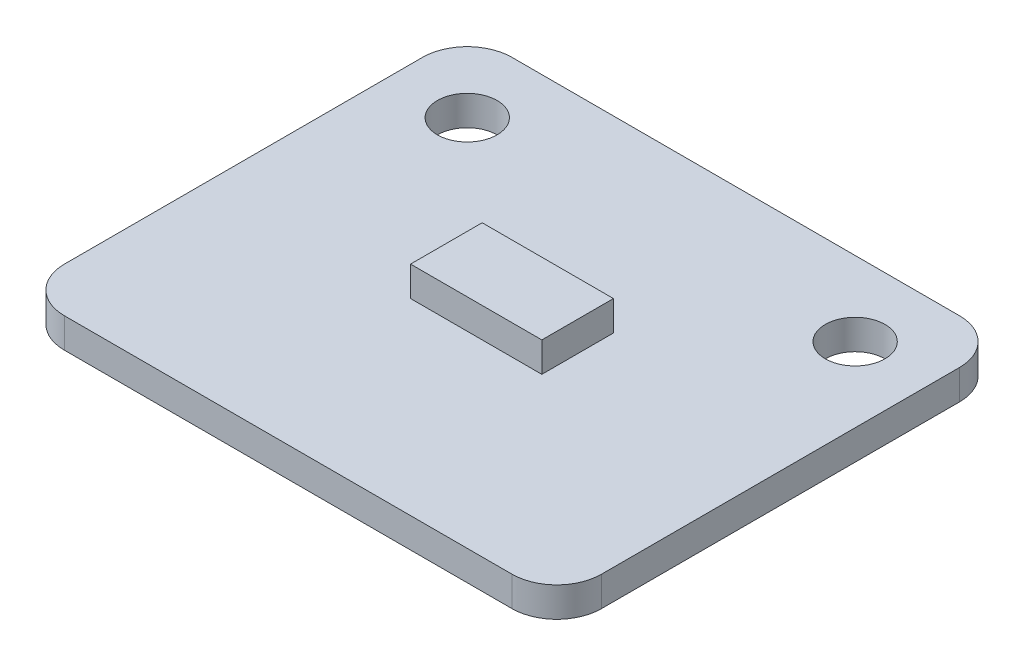
ISO-10303-21;
HEADER;
FILE_DESCRIPTION(('STEP AP214'),'2;1');
FILE_NAME('part.step','',(''),(''),'','','');
FILE_SCHEMA(('AUTOMOTIVE_DESIGN { 1 0 10303 214 1 1 1 1 }'));
ENDSEC;
DATA;
#1=APPLICATION_CONTEXT('core data for automotive mechanical design processes');
#2=APPLICATION_PROTOCOL_DEFINITION('international standard','automotive_design',2000,#1);
#3=PRODUCT_CONTEXT('',#1,'mechanical');
#4=PRODUCT('Part','Part','',(#3));
#5=PRODUCT_RELATED_PRODUCT_CATEGORY('part','',(#4));
#6=PRODUCT_DEFINITION_FORMATION('','',#4);
#7=PRODUCT_DEFINITION_CONTEXT('part definition',#1,'design');
#8=PRODUCT_DEFINITION('design','',#6,#7);
#9=PRODUCT_DEFINITION_SHAPE('','',#8);
#10=(LENGTH_UNIT() NAMED_UNIT(*) SI_UNIT(.MILLI.,.METRE.));
#11=(NAMED_UNIT(*) PLANE_ANGLE_UNIT() SI_UNIT($,.RADIAN.));
#12=(NAMED_UNIT(*) SI_UNIT($,.STERADIAN.) SOLID_ANGLE_UNIT());
#13=UNCERTAINTY_MEASURE_WITH_UNIT(LENGTH_MEASURE(1.E-05),#10,'distance_accuracy_value','');
#14=(GEOMETRIC_REPRESENTATION_CONTEXT(3) GLOBAL_UNCERTAINTY_ASSIGNED_CONTEXT((#13)) GLOBAL_UNIT_ASSIGNED_CONTEXT((#10,
#11,#12)) REPRESENTATION_CONTEXT('',''));
#15=CARTESIAN_POINT('',(0.,0.,0.));
#16=DIRECTION('',(0.,0.,1.));
#17=DIRECTION('',(1.,0.,0.));
#18=AXIS2_PLACEMENT_3D('',#15,#16,#17);
#19=CARTESIAN_POINT('',(0.,0.,0.));
#20=DIRECTION('',(0.,-1.,0.));
#21=DIRECTION('',(0.,0.,-1.));
#22=AXIS2_PLACEMENT_3D('',#19,#20,#21);
#23=PLANE('',#22);
#24=DIRECTION('',(1.,0.,0.));
#25=VECTOR('',#24,1.);
#26=CARTESIAN_POINT('',(-9.,0.,-7.5));
#27=LINE('',#26,#25);
#28=CARTESIAN_POINT('',(-7.5,0.,-7.5));
#29=VERTEX_POINT('',#28);
#30=CARTESIAN_POINT('',(7.5,0.,-7.5));
#31=VERTEX_POINT('',#30);
#32=EDGE_CURVE('E233',#29,#31,#27,.T.);
#33=ORIENTED_EDGE('',*,*,#32,.F.);
#34=CARTESIAN_POINT('',(-7.5,0.,-6.));
#35=DIRECTION('',(0.,-1.,0.));
#36=DIRECTION('',(0.,0.,-1.));
#37=AXIS2_PLACEMENT_3D('',#34,#35,#36);
#38=CIRCLE('',#37,1.5);
#39=CARTESIAN_POINT('',(-9.,0.,-6.));
#40=VERTEX_POINT('',#39);
#41=EDGE_CURVE('E259',#29,#40,#38,.F.);
#42=ORIENTED_EDGE('',*,*,#41,.T.);
#43=DIRECTION('',(0.,0.,-1.));
#44=VECTOR('',#43,1.);
#45=CARTESIAN_POINT('',(-9.,0.,7.5));
#46=LINE('',#45,#44);
#47=CARTESIAN_POINT('',(-9.,0.,6.));
#48=VERTEX_POINT('',#47);
#49=EDGE_CURVE('E209',#48,#40,#46,.T.);
#50=ORIENTED_EDGE('',*,*,#49,.F.);
#51=CARTESIAN_POINT('',(-7.5,0.,6.));
#52=DIRECTION('',(0.,-1.,0.));
#53=DIRECTION('',(0.,0.,-1.));
#54=AXIS2_PLACEMENT_3D('',#51,#52,#53);
#55=CIRCLE('',#54,1.5);
#56=CARTESIAN_POINT('',(-7.5,0.,7.5));
#57=VERTEX_POINT('',#56);
#58=EDGE_CURVE('E250',#48,#57,#55,.F.);
#59=ORIENTED_EDGE('',*,*,#58,.T.);
#60=DIRECTION('',(1.,0.,0.));
#61=VECTOR('',#60,1.);
#62=CARTESIAN_POINT('',(-9.,0.,7.5));
#63=LINE('',#62,#61);
#64=CARTESIAN_POINT('',(7.5,0.,7.5));
#65=VERTEX_POINT('',#64);
#66=EDGE_CURVE('E218',#57,#65,#63,.T.);
#67=ORIENTED_EDGE('',*,*,#66,.T.);
#68=CARTESIAN_POINT('',(7.5,0.,6.));
#69=DIRECTION('',(0.,-1.,0.));
#70=DIRECTION('',(0.,0.,-1.));
#71=AXIS2_PLACEMENT_3D('',#68,#69,#70);
#72=CIRCLE('',#71,1.5);
#73=CARTESIAN_POINT('',(9.,0.,6.));
#74=VERTEX_POINT('',#73);
#75=EDGE_CURVE('E253',#65,#74,#72,.F.);
#76=ORIENTED_EDGE('',*,*,#75,.T.);
#77=DIRECTION('',(0.,0.,-1.));
#78=VECTOR('',#77,1.);
#79=CARTESIAN_POINT('',(9.,0.,7.5));
#80=LINE('',#79,#78);
#81=CARTESIAN_POINT('',(9.,0.,-6.));
#82=VERTEX_POINT('',#81);
#83=EDGE_CURVE('E237',#74,#82,#80,.T.);
#84=ORIENTED_EDGE('',*,*,#83,.T.);
#85=CARTESIAN_POINT('',(7.5,0.,-6.));
#86=DIRECTION('',(0.,-1.,0.));
#87=DIRECTION('',(0.,0.,-1.));
#88=AXIS2_PLACEMENT_3D('',#85,#86,#87);
#89=CIRCLE('',#88,1.5);
#90=EDGE_CURVE('E256',#82,#31,#89,.F.);
#91=ORIENTED_EDGE('',*,*,#90,.T.);
#92=EDGE_LOOP('',(#33,#42,#50,#59,#67,#76,#84,#91));
#93=FACE_BOUND('',#92,.T.);
#94=CARTESIAN_POINT('',(-6.5,0.,-5.));
#95=DIRECTION('',(0.,1.,0.));
#96=DIRECTION('',(0.,0.,1.));
#97=AXIS2_PLACEMENT_3D('',#94,#95,#96);
#98=CIRCLE('',#97,1.);
#99=CARTESIAN_POINT('',(-6.5,0.,-4.));
#100=VERTEX_POINT('',#99);
#101=EDGE_CURVE('E203',#100,#100,#98,.T.);
#102=ORIENTED_EDGE('',*,*,#101,.F.);
#103=EDGE_LOOP('',(#102));
#104=FACE_BOUND('',#103,.T.);
#105=CARTESIAN_POINT('',(6.5,0.,-5.));
#106=DIRECTION('',(0.,1.,0.));
#107=DIRECTION('',(0.,0.,1.));
#108=AXIS2_PLACEMENT_3D('',#105,#106,#107);
#109=CIRCLE('',#108,1.);
#110=CARTESIAN_POINT('',(6.5,0.,-4.));
#111=VERTEX_POINT('',#110);
#112=EDGE_CURVE('E190',#111,#111,#109,.T.);
#113=ORIENTED_EDGE('',*,*,#112,.F.);
#114=EDGE_LOOP('',(#113));
#115=FACE_BOUND('',#114,.T.);
#116=DIRECTION('',(0.,0.,1.));
#117=VECTOR('',#116,1.);
#118=CARTESIAN_POINT('',(-2.2,0.,-1.2));
#119=LINE('',#118,#117);
#120=CARTESIAN_POINT('',(-2.2,0.,-1.2));
#121=VERTEX_POINT('',#120);
#122=CARTESIAN_POINT('',(-2.2,0.,1.2));
#123=VERTEX_POINT('',#122);
#124=EDGE_CURVE('E187',#121,#123,#119,.T.);
#125=ORIENTED_EDGE('',*,*,#124,.F.);
#126=DIRECTION('',(1.,0.,0.));
#127=VECTOR('',#126,1.);
#128=CARTESIAN_POINT('',(-2.2,0.,-1.2));
#129=LINE('',#128,#127);
#130=CARTESIAN_POINT('',(2.2,0.,-1.2));
#131=VERTEX_POINT('',#130);
#132=EDGE_CURVE('E183',#121,#131,#129,.T.);
#133=ORIENTED_EDGE('',*,*,#132,.T.);
#134=DIRECTION('',(0.,0.,1.));
#135=VECTOR('',#134,1.);
#136=CARTESIAN_POINT('',(2.2,0.,-1.2));
#137=LINE('',#136,#135);
#138=CARTESIAN_POINT('',(2.2,0.,1.2));
#139=VERTEX_POINT('',#138);
#140=EDGE_CURVE('E481',#131,#139,#137,.T.);
#141=ORIENTED_EDGE('',*,*,#140,.T.);
#142=DIRECTION('',(1.,0.,0.));
#143=VECTOR('',#142,1.);
#144=CARTESIAN_POINT('',(-2.2,0.,1.2));
#145=LINE('',#144,#143);
#146=EDGE_CURVE('E483',#123,#139,#145,.T.);
#147=ORIENTED_EDGE('',*,*,#146,.F.);
#148=EDGE_LOOP('',(#125,#133,#141,#147));
#149=FACE_BOUND('',#148,.T.);
#150=ADVANCED_FACE('F71',(#93,#104,#115,#149),#23,.F.);
#151=CARTESIAN_POINT('',(-9.,-1.,7.5));
#152=DIRECTION('',(1.,0.,0.));
#153=DIRECTION('',(0.,0.,-1.));
#154=AXIS2_PLACEMENT_3D('',#151,#152,#153);
#155=PLANE('',#154);
#156=ORIENTED_EDGE('',*,*,#49,.T.);
#157=DIRECTION('',(0.,1.,0.));
#158=VECTOR('',#157,1.);
#159=CARTESIAN_POINT('',(-9.,-1.,-6.));
#160=LINE('',#159,#158);
#161=CARTESIAN_POINT('',(-9.,-1.,-6.));
#162=VERTEX_POINT('',#161);
#163=EDGE_CURVE('E266',#40,#162,#160,.F.);
#164=ORIENTED_EDGE('',*,*,#163,.T.);
#165=DIRECTION('',(0.,0.,-1.));
#166=VECTOR('',#165,1.);
#167=CARTESIAN_POINT('',(-9.,-1.,7.5));
#168=LINE('',#167,#166);
#169=CARTESIAN_POINT('',(-9.,-1.,6.));
#170=VERTEX_POINT('',#169);
#171=EDGE_CURVE('E213',#170,#162,#168,.T.);
#172=ORIENTED_EDGE('',*,*,#171,.F.);
#173=DIRECTION('',(0.,1.,0.));
#174=VECTOR('',#173,1.);
#175=CARTESIAN_POINT('',(-9.,0.,6.));
#176=LINE('',#175,#174);
#177=EDGE_CURVE('E262',#170,#48,#176,.T.);
#178=ORIENTED_EDGE('',*,*,#177,.T.);
#179=EDGE_LOOP('',(#156,#164,#172,#178));
#180=FACE_BOUND('',#179,.T.);
#181=ADVANCED_FACE('F308',(#180),#155,.F.);
#182=CARTESIAN_POINT('',(-9.,-1.,-7.5));
#183=DIRECTION('',(0.,0.,1.));
#184=DIRECTION('',(1.,0.,0.));
#185=AXIS2_PLACEMENT_3D('',#182,#183,#184);
#186=PLANE('',#185);
#187=DIRECTION('',(1.,0.,0.));
#188=VECTOR('',#187,1.);
#189=CARTESIAN_POINT('',(-9.,-1.,-7.5));
#190=LINE('',#189,#188);
#191=CARTESIAN_POINT('',(-7.5,-1.,-7.5));
#192=VERTEX_POINT('',#191);
#193=CARTESIAN_POINT('',(7.5,-1.,-7.5));
#194=VERTEX_POINT('',#193);
#195=EDGE_CURVE('E217',#192,#194,#190,.T.);
#196=ORIENTED_EDGE('',*,*,#195,.F.);
#197=DIRECTION('',(0.,1.,0.));
#198=VECTOR('',#197,1.);
#199=CARTESIAN_POINT('',(-7.5,-1.,-7.5));
#200=LINE('',#199,#198);
#201=EDGE_CURVE('E246',#192,#29,#200,.T.);
#202=ORIENTED_EDGE('',*,*,#201,.T.);
#203=ORIENTED_EDGE('',*,*,#32,.T.);
#204=DIRECTION('',(0.,1.,0.));
#205=VECTOR('',#204,1.);
#206=CARTESIAN_POINT('',(7.5,-1.,-7.5));
#207=LINE('',#206,#205);
#208=EDGE_CURVE('E229',#31,#194,#207,.F.);
#209=ORIENTED_EDGE('',*,*,#208,.T.);
#210=EDGE_LOOP('',(#196,#202,#203,#209));
#211=FACE_BOUND('',#210,.T.);
#212=ADVANCED_FACE('F316',(#211),#186,.F.);
#213=CARTESIAN_POINT('',(9.,-1.,7.5));
#214=DIRECTION('',(1.,0.,0.));
#215=DIRECTION('',(0.,0.,-1.));
#216=AXIS2_PLACEMENT_3D('',#213,#214,#215);
#217=PLANE('',#216);
#218=DIRECTION('',(0.,0.,-1.));
#219=VECTOR('',#218,1.);
#220=CARTESIAN_POINT('',(9.,-1.,7.5));
#221=LINE('',#220,#219);
#222=CARTESIAN_POINT('',(9.,-1.,6.));
#223=VERTEX_POINT('',#222);
#224=CARTESIAN_POINT('',(9.,-1.,-6.));
#225=VERTEX_POINT('',#224);
#226=EDGE_CURVE('E222',#223,#225,#221,.T.);
#227=ORIENTED_EDGE('',*,*,#226,.T.);
#228=DIRECTION('',(0.,1.,0.));
#229=VECTOR('',#228,1.);
#230=CARTESIAN_POINT('',(9.,0.,-6.));
#231=LINE('',#230,#229);
#232=EDGE_CURVE('E283',#225,#82,#231,.T.);
#233=ORIENTED_EDGE('',*,*,#232,.T.);
#234=ORIENTED_EDGE('',*,*,#83,.F.);
#235=DIRECTION('',(0.,1.,0.));
#236=VECTOR('',#235,1.);
#237=CARTESIAN_POINT('',(9.,-1.,6.));
#238=LINE('',#237,#236);
#239=EDGE_CURVE('E280',#74,#223,#238,.F.);
#240=ORIENTED_EDGE('',*,*,#239,.T.);
#241=EDGE_LOOP('',(#227,#233,#234,#240));
#242=FACE_BOUND('',#241,.T.);
#243=ADVANCED_FACE('F290',(#242),#217,.T.);
#244=CARTESIAN_POINT('',(-9.,-1.,7.5));
#245=DIRECTION('',(0.,0.,1.));
#246=DIRECTION('',(1.,0.,0.));
#247=AXIS2_PLACEMENT_3D('',#244,#245,#246);
#248=PLANE('',#247);
#249=DIRECTION('',(1.,0.,0.));
#250=VECTOR('',#249,1.);
#251=CARTESIAN_POINT('',(-9.,-1.,7.5));
#252=LINE('',#251,#250);
#253=CARTESIAN_POINT('',(-7.5,-1.,7.5));
#254=VERTEX_POINT('',#253);
#255=CARTESIAN_POINT('',(7.5,-1.,7.5));
#256=VERTEX_POINT('',#255);
#257=EDGE_CURVE('E226',#254,#256,#252,.T.);
#258=ORIENTED_EDGE('',*,*,#257,.T.);
#259=DIRECTION('',(0.,1.,0.));
#260=VECTOR('',#259,1.);
#261=CARTESIAN_POINT('',(7.5,-1.,7.5));
#262=LINE('',#261,#260);
#263=EDGE_CURVE('E12',#256,#65,#262,.T.);
#264=ORIENTED_EDGE('',*,*,#263,.T.);
#265=ORIENTED_EDGE('',*,*,#66,.F.);
#266=DIRECTION('',(0.,1.,0.));
#267=VECTOR('',#266,1.);
#268=CARTESIAN_POINT('',(-7.5,-1.,7.5));
#269=LINE('',#268,#267);
#270=EDGE_CURVE('E80',#57,#254,#269,.F.);
#271=ORIENTED_EDGE('',*,*,#270,.T.);
#272=EDGE_LOOP('',(#258,#264,#265,#271));
#273=FACE_BOUND('',#272,.T.);
#274=ADVANCED_FACE('F300',(#273),#248,.T.);
#275=CARTESIAN_POINT('',(0.,-1.,0.));
#276=DIRECTION('',(0.,-1.,0.));
#277=DIRECTION('',(0.,0.,-1.));
#278=AXIS2_PLACEMENT_3D('',#275,#276,#277);
#279=PLANE('',#278);
#280=CARTESIAN_POINT('',(6.5,-1.,-5.));
#281=DIRECTION('',(0.,1.,0.));
#282=DIRECTION('',(0.,0.,1.));
#283=AXIS2_PLACEMENT_3D('',#280,#281,#282);
#284=CIRCLE('',#283,1.);
#285=CARTESIAN_POINT('',(6.5,-1.,-4.));
#286=VERTEX_POINT('',#285);
#287=EDGE_CURVE('E195',#286,#286,#284,.T.);
#288=ORIENTED_EDGE('',*,*,#287,.T.);
#289=EDGE_LOOP('',(#288));
#290=FACE_BOUND('',#289,.T.);
#291=CARTESIAN_POINT('',(-6.5,-1.,-5.));
#292=DIRECTION('',(0.,1.,0.));
#293=DIRECTION('',(0.,0.,1.));
#294=AXIS2_PLACEMENT_3D('',#291,#292,#293);
#295=CIRCLE('',#294,1.);
#296=CARTESIAN_POINT('',(-6.5,-1.,-4.));
#297=VERTEX_POINT('',#296);
#298=EDGE_CURVE('E205',#297,#297,#295,.T.);
#299=ORIENTED_EDGE('',*,*,#298,.T.);
#300=EDGE_LOOP('',(#299));
#301=FACE_BOUND('',#300,.T.);
#302=ORIENTED_EDGE('',*,*,#171,.T.);
#303=CARTESIAN_POINT('',(-7.5,-1.,-6.));
#304=DIRECTION('',(0.,-1.,0.));
#305=DIRECTION('',(0.,0.,-1.));
#306=AXIS2_PLACEMENT_3D('',#303,#304,#305);
#307=CIRCLE('',#306,1.5);
#308=EDGE_CURVE('E277',#162,#192,#307,.T.);
#309=ORIENTED_EDGE('',*,*,#308,.T.);
#310=ORIENTED_EDGE('',*,*,#195,.T.);
#311=CARTESIAN_POINT('',(7.5,-1.,-6.));
#312=DIRECTION('',(0.,-1.,0.));
#313=DIRECTION('',(0.,0.,-1.));
#314=AXIS2_PLACEMENT_3D('',#311,#312,#313);
#315=CIRCLE('',#314,1.5);
#316=EDGE_CURVE('E274',#194,#225,#315,.T.);
#317=ORIENTED_EDGE('',*,*,#316,.T.);
#318=ORIENTED_EDGE('',*,*,#226,.F.);
#319=CARTESIAN_POINT('',(7.5,-1.,6.));
#320=DIRECTION('',(0.,-1.,0.));
#321=DIRECTION('',(0.,0.,-1.));
#322=AXIS2_PLACEMENT_3D('',#319,#320,#321);
#323=CIRCLE('',#322,1.5);
#324=EDGE_CURVE('E87',#223,#256,#323,.T.);
#325=ORIENTED_EDGE('',*,*,#324,.T.);
#326=ORIENTED_EDGE('',*,*,#257,.F.);
#327=CARTESIAN_POINT('',(-7.5,-1.,6.));
#328=DIRECTION('',(0.,-1.,0.));
#329=DIRECTION('',(0.,0.,-1.));
#330=AXIS2_PLACEMENT_3D('',#327,#328,#329);
#331=CIRCLE('',#330,1.5);
#332=EDGE_CURVE('E269',#254,#170,#331,.T.);
#333=ORIENTED_EDGE('',*,*,#332,.T.);
#334=EDGE_LOOP('',(#302,#309,#310,#317,#318,#325,#326,#333));
#335=FACE_BOUND('',#334,.T.);
#336=ADVANCED_FACE('F302',(#290,#301,#335),#279,.T.);
#337=CARTESIAN_POINT('',(-6.5,-1.,-5.));
#338=DIRECTION('',(0.,1.,0.));
#339=DIRECTION('',(0.,0.,1.));
#340=AXIS2_PLACEMENT_3D('',#337,#338,#339);
#341=CYLINDRICAL_SURFACE('',#340,1.);
#342=ORIENTED_EDGE('',*,*,#298,.F.);
#343=EDGE_LOOP('',(#342));
#344=FACE_BOUND('',#343,.T.);
#345=ORIENTED_EDGE('',*,*,#101,.T.);
#346=EDGE_LOOP('',(#345));
#347=FACE_BOUND('',#346,.T.);
#348=ADVANCED_FACE('F358',(#344,#347),#341,.F.);
#349=CARTESIAN_POINT('',(6.5,-1.,-5.));
#350=DIRECTION('',(0.,1.,0.));
#351=DIRECTION('',(0.,0.,1.));
#352=AXIS2_PLACEMENT_3D('',#349,#350,#351);
#353=CYLINDRICAL_SURFACE('',#352,1.);
#354=ORIENTED_EDGE('',*,*,#287,.F.);
#355=EDGE_LOOP('',(#354));
#356=FACE_BOUND('',#355,.T.);
#357=ORIENTED_EDGE('',*,*,#112,.T.);
#358=EDGE_LOOP('',(#357));
#359=FACE_BOUND('',#358,.T.);
#360=ADVANCED_FACE('F366',(#356,#359),#353,.F.);
#361=CARTESIAN_POINT('',(-2.2,1.,-1.2));
#362=DIRECTION('',(1.,0.,0.));
#363=DIRECTION('',(0.,0.,-1.));
#364=AXIS2_PLACEMENT_3D('',#361,#362,#363);
#365=PLANE('',#364);
#366=ORIENTED_EDGE('',*,*,#124,.T.);
#367=DIRECTION('',(0.,-1.,0.));
#368=VECTOR('',#367,1.);
#369=CARTESIAN_POINT('',(-2.2,1.,1.2));
#370=LINE('',#369,#368);
#371=CARTESIAN_POINT('',(-2.2,1.,1.2));
#372=VERTEX_POINT('',#371);
#373=EDGE_CURVE('E166',#372,#123,#370,.T.);
#374=ORIENTED_EDGE('',*,*,#373,.F.);
#375=DIRECTION('',(0.,0.,1.));
#376=VECTOR('',#375,1.);
#377=CARTESIAN_POINT('',(-2.2,1.,-1.2));
#378=LINE('',#377,#376);
#379=CARTESIAN_POINT('',(-2.2,1.,-1.2));
#380=VERTEX_POINT('',#379);
#381=EDGE_CURVE('E174',#380,#372,#378,.T.);
#382=ORIENTED_EDGE('',*,*,#381,.F.);
#383=DIRECTION('',(0.,-1.,0.));
#384=VECTOR('',#383,1.);
#385=CARTESIAN_POINT('',(-2.2,1.,-1.2));
#386=LINE('',#385,#384);
#387=EDGE_CURVE('E477',#380,#121,#386,.T.);
#388=ORIENTED_EDGE('',*,*,#387,.T.);
#389=EDGE_LOOP('',(#366,#374,#382,#388));
#390=FACE_BOUND('',#389,.T.);
#391=ADVANCED_FACE('F185',(#390),#365,.F.);
#392=CARTESIAN_POINT('',(-2.2,1.,1.2));
#393=DIRECTION('',(0.,0.,-1.));
#394=DIRECTION('',(-1.,0.,0.));
#395=AXIS2_PLACEMENT_3D('',#392,#393,#394);
#396=PLANE('',#395);
#397=ORIENTED_EDGE('',*,*,#146,.T.);
#398=DIRECTION('',(0.,-1.,0.));
#399=VECTOR('',#398,1.);
#400=CARTESIAN_POINT('',(2.2,1.,1.2));
#401=LINE('',#400,#399);
#402=CARTESIAN_POINT('',(2.2,1.,1.2));
#403=VERTEX_POINT('',#402);
#404=EDGE_CURVE('E168',#403,#139,#401,.T.);
#405=ORIENTED_EDGE('',*,*,#404,.F.);
#406=DIRECTION('',(1.,0.,0.));
#407=VECTOR('',#406,1.);
#408=CARTESIAN_POINT('',(-2.2,1.,1.2));
#409=LINE('',#408,#407);
#410=EDGE_CURVE('E161',#372,#403,#409,.T.);
#411=ORIENTED_EDGE('',*,*,#410,.F.);
#412=ORIENTED_EDGE('',*,*,#373,.T.);
#413=EDGE_LOOP('',(#397,#405,#411,#412));
#414=FACE_BOUND('',#413,.T.);
#415=ADVANCED_FACE('F164',(#414),#396,.F.);
#416=CARTESIAN_POINT('',(2.2,1.,-1.2));
#417=DIRECTION('',(1.,0.,0.));
#418=DIRECTION('',(0.,0.,-1.));
#419=AXIS2_PLACEMENT_3D('',#416,#417,#418);
#420=PLANE('',#419);
#421=ORIENTED_EDGE('',*,*,#140,.F.);
#422=DIRECTION('',(0.,-1.,0.));
#423=VECTOR('',#422,1.);
#424=CARTESIAN_POINT('',(2.2,1.,-1.2));
#425=LINE('',#424,#423);
#426=CARTESIAN_POINT('',(2.2,1.,-1.2));
#427=VERTEX_POINT('',#426);
#428=EDGE_CURVE('E197',#427,#131,#425,.T.);
#429=ORIENTED_EDGE('',*,*,#428,.F.);
#430=DIRECTION('',(0.,0.,1.));
#431=VECTOR('',#430,1.);
#432=CARTESIAN_POINT('',(2.2,1.,-1.2));
#433=LINE('',#432,#431);
#434=EDGE_CURVE('E173',#427,#403,#433,.T.);
#435=ORIENTED_EDGE('',*,*,#434,.T.);
#436=ORIENTED_EDGE('',*,*,#404,.T.);
#437=EDGE_LOOP('',(#421,#429,#435,#436));
#438=FACE_BOUND('',#437,.T.);
#439=ADVANCED_FACE('F387',(#438),#420,.T.);
#440=CARTESIAN_POINT('',(-2.2,1.,-1.2));
#441=DIRECTION('',(0.,0.,-1.));
#442=DIRECTION('',(-1.,0.,0.));
#443=AXIS2_PLACEMENT_3D('',#440,#441,#442);
#444=PLANE('',#443);
#445=ORIENTED_EDGE('',*,*,#132,.F.);
#446=ORIENTED_EDGE('',*,*,#387,.F.);
#447=DIRECTION('',(1.,0.,0.));
#448=VECTOR('',#447,1.);
#449=CARTESIAN_POINT('',(-2.2,1.,-1.2));
#450=LINE('',#449,#448);
#451=EDGE_CURVE('E180',#380,#427,#450,.T.);
#452=ORIENTED_EDGE('',*,*,#451,.T.);
#453=ORIENTED_EDGE('',*,*,#428,.T.);
#454=EDGE_LOOP('',(#445,#446,#452,#453));
#455=FACE_BOUND('',#454,.T.);
#456=ADVANCED_FACE('F394',(#455),#444,.T.);
#457=CARTESIAN_POINT('',(0.,1.,0.));
#458=DIRECTION('',(0.,1.,0.));
#459=DIRECTION('',(0.,0.,1.));
#460=AXIS2_PLACEMENT_3D('',#457,#458,#459);
#461=PLANE('',#460);
#462=ORIENTED_EDGE('',*,*,#381,.T.);
#463=ORIENTED_EDGE('',*,*,#410,.T.);
#464=ORIENTED_EDGE('',*,*,#434,.F.);
#465=ORIENTED_EDGE('',*,*,#451,.F.);
#466=EDGE_LOOP('',(#462,#463,#464,#465));
#467=FACE_BOUND('',#466,.T.);
#468=ADVANCED_FACE('F178',(#467),#461,.T.);
#469=CARTESIAN_POINT('',(-7.5,-1.,-6.));
#470=DIRECTION('',(0.,1.,0.));
#471=DIRECTION('',(0.,0.,1.));
#472=AXIS2_PLACEMENT_3D('',#469,#470,#471);
#473=CYLINDRICAL_SURFACE('',#472,1.5);
#474=ORIENTED_EDGE('',*,*,#308,.F.);
#475=ORIENTED_EDGE('',*,*,#163,.F.);
#476=ORIENTED_EDGE('',*,*,#41,.F.);
#477=ORIENTED_EDGE('',*,*,#201,.F.);
#478=EDGE_LOOP('',(#474,#475,#476,#477));
#479=FACE_BOUND('',#478,.T.);
#480=ADVANCED_FACE('F313',(#479),#473,.T.);
#481=CARTESIAN_POINT('',(7.5,-1.,-6.));
#482=DIRECTION('',(0.,-1.,0.));
#483=DIRECTION('',(0.,0.,-1.));
#484=AXIS2_PLACEMENT_3D('',#481,#482,#483);
#485=CYLINDRICAL_SURFACE('',#484,1.5);
#486=ORIENTED_EDGE('',*,*,#316,.F.);
#487=ORIENTED_EDGE('',*,*,#208,.F.);
#488=ORIENTED_EDGE('',*,*,#90,.F.);
#489=ORIENTED_EDGE('',*,*,#232,.F.);
#490=EDGE_LOOP('',(#486,#487,#488,#489));
#491=FACE_BOUND('',#490,.T.);
#492=ADVANCED_FACE('F318',(#491),#485,.T.);
#493=CARTESIAN_POINT('',(7.5,-1.,6.));
#494=DIRECTION('',(0.,1.,0.));
#495=DIRECTION('',(0.,0.,1.));
#496=AXIS2_PLACEMENT_3D('',#493,#494,#495);
#497=CYLINDRICAL_SURFACE('',#496,1.5);
#498=ORIENTED_EDGE('',*,*,#324,.F.);
#499=ORIENTED_EDGE('',*,*,#239,.F.);
#500=ORIENTED_EDGE('',*,*,#75,.F.);
#501=ORIENTED_EDGE('',*,*,#263,.F.);
#502=EDGE_LOOP('',(#498,#499,#500,#501));
#503=FACE_BOUND('',#502,.T.);
#504=ADVANCED_FACE('F299',(#503),#497,.T.);
#505=CARTESIAN_POINT('',(-7.5,-1.,6.));
#506=DIRECTION('',(0.,-1.,0.));
#507=DIRECTION('',(0.,0.,-1.));
#508=AXIS2_PLACEMENT_3D('',#505,#506,#507);
#509=CYLINDRICAL_SURFACE('',#508,1.5);
#510=ORIENTED_EDGE('',*,*,#332,.F.);
#511=ORIENTED_EDGE('',*,*,#270,.F.);
#512=ORIENTED_EDGE('',*,*,#58,.F.);
#513=ORIENTED_EDGE('',*,*,#177,.F.);
#514=EDGE_LOOP('',(#510,#511,#512,#513));
#515=FACE_BOUND('',#514,.T.);
#516=ADVANCED_FACE('F73',(#515),#509,.T.);
#517=CLOSED_SHELL('',(#150,#181,#212,#243,#274,#336,#348,#360,#391,#415,#439,#456,#468,#480,
#492,#504,#516));
#518=MANIFOLD_SOLID_BREP('B2',#517);
#519=ADVANCED_BREP_SHAPE_REPRESENTATION('',(#18,#518),#14);
#520=SHAPE_DEFINITION_REPRESENTATION(#9,#519);
ENDSEC;
END-ISO-10303-21;
